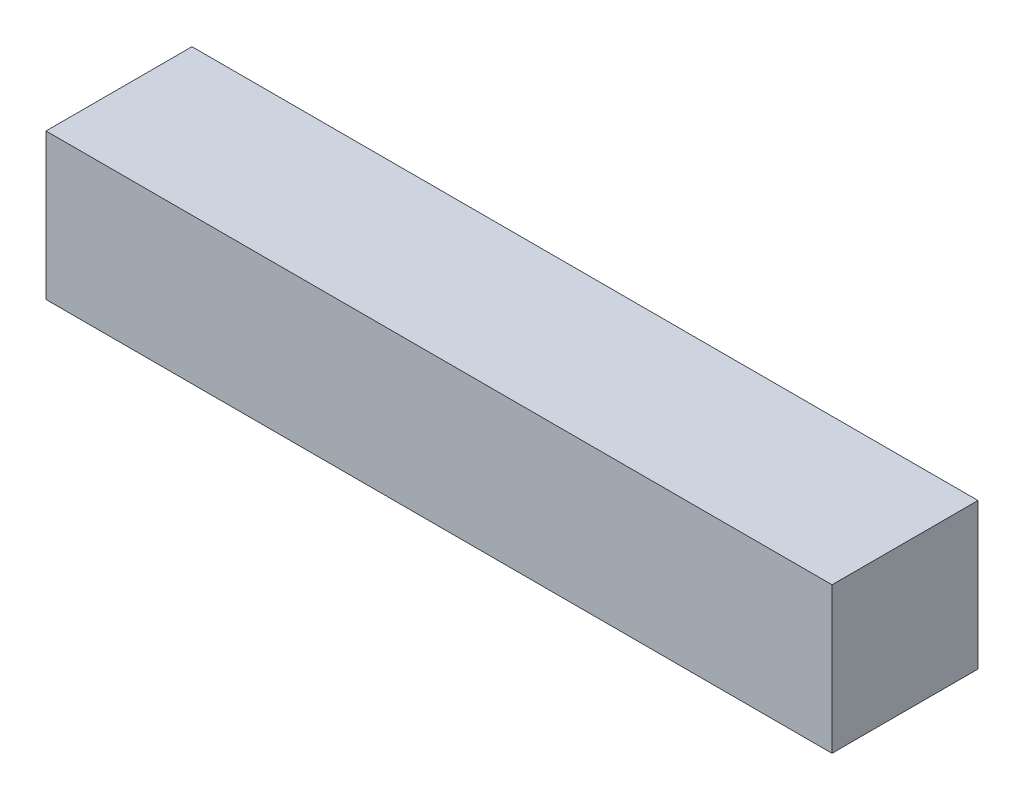
ISO-10303-21;
HEADER;
FILE_DESCRIPTION(('STEP AP214'),'2;1');
FILE_NAME('part.step','',(''),(''),'','','');
FILE_SCHEMA(('AUTOMOTIVE_DESIGN { 1 0 10303 214 1 1 1 1 }'));
ENDSEC;
DATA;
#1=APPLICATION_CONTEXT('core data for automotive mechanical design processes');
#2=APPLICATION_PROTOCOL_DEFINITION('international standard','automotive_design',2000,#1);
#3=PRODUCT_CONTEXT('',#1,'mechanical');
#4=PRODUCT('Part','Part','',(#3));
#5=PRODUCT_RELATED_PRODUCT_CATEGORY('part','',(#4));
#6=PRODUCT_DEFINITION_FORMATION('','',#4);
#7=PRODUCT_DEFINITION_CONTEXT('part definition',#1,'design');
#8=PRODUCT_DEFINITION('design','',#6,#7);
#9=PRODUCT_DEFINITION_SHAPE('','',#8);
#10=(LENGTH_UNIT() NAMED_UNIT(*) SI_UNIT(.MILLI.,.METRE.));
#11=(NAMED_UNIT(*) PLANE_ANGLE_UNIT() SI_UNIT($,.RADIAN.));
#12=(NAMED_UNIT(*) SI_UNIT($,.STERADIAN.) SOLID_ANGLE_UNIT());
#13=UNCERTAINTY_MEASURE_WITH_UNIT(LENGTH_MEASURE(1.E-05),#10,'distance_accuracy_value','');
#14=(GEOMETRIC_REPRESENTATION_CONTEXT(3) GLOBAL_UNCERTAINTY_ASSIGNED_CONTEXT((#13)) GLOBAL_UNIT_ASSIGNED_CONTEXT((#10,
#11,#12)) REPRESENTATION_CONTEXT('',''));
#15=CARTESIAN_POINT('',(0.,0.,0.));
#16=DIRECTION('',(0.,0.,1.));
#17=DIRECTION('',(1.,0.,0.));
#18=AXIS2_PLACEMENT_3D('',#15,#16,#17);
#19=CARTESIAN_POINT('',(7.,1.3,2.6));
#20=DIRECTION('',(-1.,0.,0.));
#21=DIRECTION('',(0.,-1.,0.));
#22=AXIS2_PLACEMENT_3D('',#19,#20,#21);
#23=PLANE('',#22);
#24=DIRECTION('',(0.,1.,0.));
#25=VECTOR('',#24,1.);
#26=CARTESIAN_POINT('',(7.,1.3,0.));
#27=LINE('',#26,#25);
#28=CARTESIAN_POINT('',(7.,-1.3,0.));
#29=VERTEX_POINT('',#28);
#30=CARTESIAN_POINT('',(7.,1.3,0.));
#31=VERTEX_POINT('',#30);
#32=EDGE_CURVE('E107',#29,#31,#27,.T.);
#33=ORIENTED_EDGE('',*,*,#32,.T.);
#34=DIRECTION('',(0.,0.,-1.));
#35=VECTOR('',#34,1.);
#36=CARTESIAN_POINT('',(7.,1.3,2.6));
#37=LINE('',#36,#35);
#38=CARTESIAN_POINT('',(7.,1.3,2.6));
#39=VERTEX_POINT('',#38);
#40=EDGE_CURVE('E11',#39,#31,#37,.T.);
#41=ORIENTED_EDGE('',*,*,#40,.F.);
#42=DIRECTION('',(0.,1.,0.));
#43=VECTOR('',#42,1.);
#44=CARTESIAN_POINT('',(7.,1.3,2.6));
#45=LINE('',#44,#43);
#46=CARTESIAN_POINT('',(7.,-1.3,2.6));
#47=VERTEX_POINT('',#46);
#48=EDGE_CURVE('E91',#47,#39,#45,.T.);
#49=ORIENTED_EDGE('',*,*,#48,.F.);
#50=DIRECTION('',(0.,0.,-1.));
#51=VECTOR('',#50,1.);
#52=CARTESIAN_POINT('',(7.,-1.3,2.6));
#53=LINE('',#52,#51);
#54=EDGE_CURVE('E103',#47,#29,#53,.T.);
#55=ORIENTED_EDGE('',*,*,#54,.T.);
#56=EDGE_LOOP('',(#33,#41,#49,#55));
#57=FACE_BOUND('',#56,.T.);
#58=ADVANCED_FACE('F39',(#57),#23,.F.);
#59=CARTESIAN_POINT('',(-7.,1.3,2.6));
#60=DIRECTION('',(0.,-1.,0.));
#61=DIRECTION('',(0.,0.,-1.));
#62=AXIS2_PLACEMENT_3D('',#59,#60,#61);
#63=PLANE('',#62);
#64=DIRECTION('',(-1.,0.,0.));
#65=VECTOR('',#64,1.);
#66=CARTESIAN_POINT('',(-7.,1.3,0.));
#67=LINE('',#66,#65);
#68=CARTESIAN_POINT('',(-7.,1.3,0.));
#69=VERTEX_POINT('',#68);
#70=EDGE_CURVE('E96',#31,#69,#67,.T.);
#71=ORIENTED_EDGE('',*,*,#70,.T.);
#72=DIRECTION('',(0.,0.,-1.));
#73=VECTOR('',#72,1.);
#74=CARTESIAN_POINT('',(-7.,1.3,2.6));
#75=LINE('',#74,#73);
#76=CARTESIAN_POINT('',(-7.,1.3,2.6));
#77=VERTEX_POINT('',#76);
#78=EDGE_CURVE('E48',#77,#69,#75,.T.);
#79=ORIENTED_EDGE('',*,*,#78,.F.);
#80=DIRECTION('',(-1.,0.,0.));
#81=VECTOR('',#80,1.);
#82=CARTESIAN_POINT('',(-7.,1.3,2.6));
#83=LINE('',#82,#81);
#84=EDGE_CURVE('E86',#39,#77,#83,.T.);
#85=ORIENTED_EDGE('',*,*,#84,.F.);
#86=ORIENTED_EDGE('',*,*,#40,.T.);
#87=EDGE_LOOP('',(#71,#79,#85,#86));
#88=FACE_BOUND('',#87,.T.);
#89=ADVANCED_FACE('F95',(#88),#63,.F.);
#90=CARTESIAN_POINT('',(-7.,1.3,2.6));
#91=DIRECTION('',(1.,0.,0.));
#92=DIRECTION('',(0.,0.,-1.));
#93=AXIS2_PLACEMENT_3D('',#90,#91,#92);
#94=PLANE('',#93);
#95=DIRECTION('',(0.,-1.,0.));
#96=VECTOR('',#95,1.);
#97=CARTESIAN_POINT('',(-7.,1.3,0.));
#98=LINE('',#97,#96);
#99=CARTESIAN_POINT('',(-7.,-1.3,0.));
#100=VERTEX_POINT('',#99);
#101=EDGE_CURVE('E73',#69,#100,#98,.T.);
#102=ORIENTED_EDGE('',*,*,#101,.T.);
#103=DIRECTION('',(0.,0.,-1.));
#104=VECTOR('',#103,1.);
#105=CARTESIAN_POINT('',(-7.,-1.3,2.6));
#106=LINE('',#105,#104);
#107=CARTESIAN_POINT('',(-7.,-1.3,2.6));
#108=VERTEX_POINT('',#107);
#109=EDGE_CURVE('E98',#108,#100,#106,.T.);
#110=ORIENTED_EDGE('',*,*,#109,.F.);
#111=DIRECTION('',(0.,-1.,0.));
#112=VECTOR('',#111,1.);
#113=CARTESIAN_POINT('',(-7.,1.3,2.6));
#114=LINE('',#113,#112);
#115=EDGE_CURVE('E89',#77,#108,#114,.T.);
#116=ORIENTED_EDGE('',*,*,#115,.F.);
#117=ORIENTED_EDGE('',*,*,#78,.T.);
#118=EDGE_LOOP('',(#102,#110,#116,#117));
#119=FACE_BOUND('',#118,.T.);
#120=ADVANCED_FACE('F99',(#119),#94,.F.);
#121=CARTESIAN_POINT('',(-7.,-1.3,2.6));
#122=DIRECTION('',(0.,1.,0.));
#123=DIRECTION('',(0.,0.,1.));
#124=AXIS2_PLACEMENT_3D('',#121,#122,#123);
#125=PLANE('',#124);
#126=DIRECTION('',(1.,0.,0.));
#127=VECTOR('',#126,1.);
#128=CARTESIAN_POINT('',(-7.,-1.3,0.));
#129=LINE('',#128,#127);
#130=EDGE_CURVE('E79',#100,#29,#129,.T.);
#131=ORIENTED_EDGE('',*,*,#130,.T.);
#132=ORIENTED_EDGE('',*,*,#54,.F.);
#133=DIRECTION('',(1.,0.,0.));
#134=VECTOR('',#133,1.);
#135=CARTESIAN_POINT('',(-7.,-1.3,2.6));
#136=LINE('',#135,#134);
#137=EDGE_CURVE('E56',#108,#47,#136,.T.);
#138=ORIENTED_EDGE('',*,*,#137,.F.);
#139=ORIENTED_EDGE('',*,*,#109,.T.);
#140=EDGE_LOOP('',(#131,#132,#138,#139));
#141=FACE_BOUND('',#140,.T.);
#142=ADVANCED_FACE('F120',(#141),#125,.F.);
#143=CARTESIAN_POINT('',(0.,0.,2.6));
#144=DIRECTION('',(0.,0.,1.));
#145=DIRECTION('',(1.,0.,0.));
#146=AXIS2_PLACEMENT_3D('',#143,#144,#145);
#147=PLANE('',#146);
#148=ORIENTED_EDGE('',*,*,#48,.T.);
#149=ORIENTED_EDGE('',*,*,#84,.T.);
#150=ORIENTED_EDGE('',*,*,#115,.T.);
#151=ORIENTED_EDGE('',*,*,#137,.T.);
#152=EDGE_LOOP('',(#148,#149,#150,#151));
#153=FACE_BOUND('',#152,.T.);
#154=ADVANCED_FACE('F87',(#153),#147,.T.);
#155=CARTESIAN_POINT('',(0.,0.,0.));
#156=DIRECTION('',(0.,0.,1.));
#157=DIRECTION('',(1.,0.,0.));
#158=AXIS2_PLACEMENT_3D('',#155,#156,#157);
#159=PLANE('',#158);
#160=ORIENTED_EDGE('',*,*,#32,.F.);
#161=ORIENTED_EDGE('',*,*,#130,.F.);
#162=ORIENTED_EDGE('',*,*,#101,.F.);
#163=ORIENTED_EDGE('',*,*,#70,.F.);
#164=EDGE_LOOP('',(#160,#161,#162,#163));
#165=FACE_BOUND('',#164,.T.);
#166=ADVANCED_FACE('F123',(#165),#159,.F.);
#167=CLOSED_SHELL('',(#58,#89,#120,#142,#154,#166));
#168=MANIFOLD_SOLID_BREP('B2',#167);
#169=ADVANCED_BREP_SHAPE_REPRESENTATION('',(#18,#168),#14);
#170=SHAPE_DEFINITION_REPRESENTATION(#9,#169);
ENDSEC;
END-ISO-10303-21;
